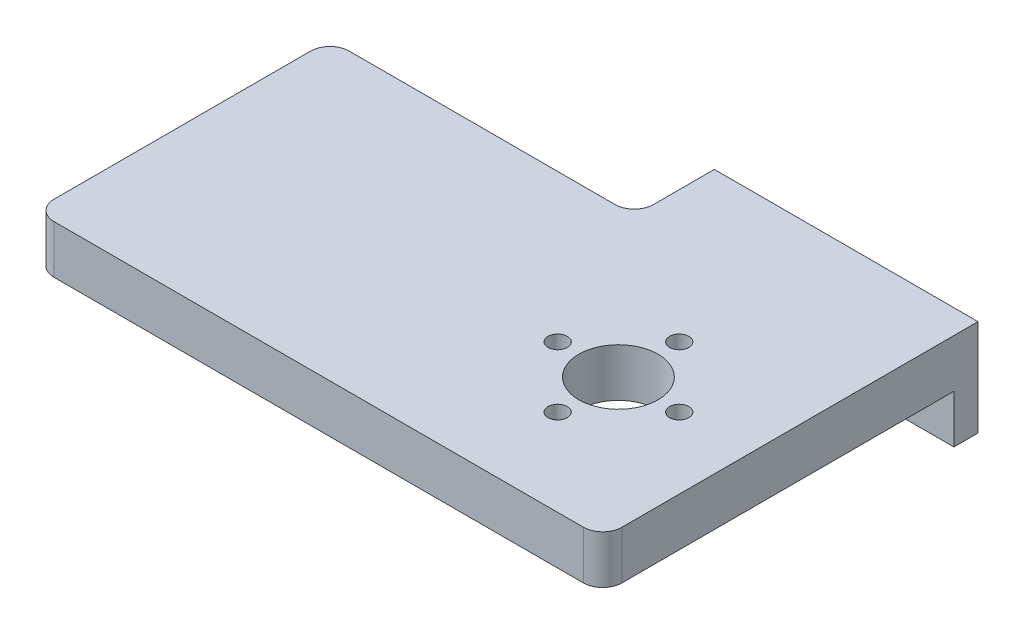
ISO-10303-21;
HEADER;
FILE_DESCRIPTION(('STEP AP214'),'2;1');
FILE_NAME('part.step','',(''),(''),'','','');
FILE_SCHEMA(('AUTOMOTIVE_DESIGN { 1 0 10303 214 1 1 1 1 }'));
ENDSEC;
DATA;
#1=APPLICATION_CONTEXT('core data for automotive mechanical design processes');
#2=APPLICATION_PROTOCOL_DEFINITION('international standard','automotive_design',2000,#1);
#3=PRODUCT_CONTEXT('',#1,'mechanical');
#4=PRODUCT('Part','Part','',(#3));
#5=PRODUCT_RELATED_PRODUCT_CATEGORY('part','',(#4));
#6=PRODUCT_DEFINITION_FORMATION('','',#4);
#7=PRODUCT_DEFINITION_CONTEXT('part definition',#1,'design');
#8=PRODUCT_DEFINITION('design','',#6,#7);
#9=PRODUCT_DEFINITION_SHAPE('','',#8);
#10=(LENGTH_UNIT() NAMED_UNIT(*) SI_UNIT(.MILLI.,.METRE.));
#11=(NAMED_UNIT(*) PLANE_ANGLE_UNIT() SI_UNIT($,.RADIAN.));
#12=(NAMED_UNIT(*) SI_UNIT($,.STERADIAN.) SOLID_ANGLE_UNIT());
#13=UNCERTAINTY_MEASURE_WITH_UNIT(LENGTH_MEASURE(1.E-05),#10,'distance_accuracy_value','');
#14=(GEOMETRIC_REPRESENTATION_CONTEXT(3) GLOBAL_UNCERTAINTY_ASSIGNED_CONTEXT((#13)) GLOBAL_UNIT_ASSIGNED_CONTEXT((#10,
#11,#12)) REPRESENTATION_CONTEXT('',''));
#15=CARTESIAN_POINT('',(0.,0.,0.));
#16=DIRECTION('',(0.,0.,1.));
#17=DIRECTION('',(1.,0.,0.));
#18=AXIS2_PLACEMENT_3D('',#15,#16,#17);
#19=CARTESIAN_POINT('',(-19.6575695119962,6.35,28.2169488414724));
#20=DIRECTION('',(0.,-1.,0.));
#21=DIRECTION('',(0.,0.,-1.));
#22=AXIS2_PLACEMENT_3D('',#19,#20,#21);
#23=CYLINDRICAL_SURFACE('',#22,16.256);
#24=CARTESIAN_POINT('',(-19.6575695119962,0.,28.2169488414724));
#25=DIRECTION('',(0.,1.,0.));
#26=DIRECTION('',(0.,0.,1.));
#27=AXIS2_PLACEMENT_3D('',#24,#25,#26);
#28=CIRCLE('',#27,16.256);
#29=CARTESIAN_POINT('',(-19.6575695119962,0.,44.4729488414724));
#30=VERTEX_POINT('',#29);
#31=EDGE_CURVE('E190',#30,#30,#28,.T.);
#32=ORIENTED_EDGE('',*,*,#31,.F.);
#33=EDGE_LOOP('',(#32));
#34=FACE_BOUND('',#33,.T.);
#35=CARTESIAN_POINT('',(-19.6575695119962,3.175,28.2169488414724));
#36=DIRECTION('',(0.,1.,0.));
#37=DIRECTION('',(0.,0.,1.));
#38=AXIS2_PLACEMENT_3D('',#35,#36,#37);
#39=CIRCLE('',#38,16.256);
#40=CARTESIAN_POINT('',(-19.6575695119962,3.175,44.4729488414724));
#41=VERTEX_POINT('',#40);
#42=EDGE_CURVE('E163',#41,#41,#39,.T.);
#43=ORIENTED_EDGE('',*,*,#42,.T.);
#44=EDGE_LOOP('',(#43));
#45=FACE_BOUND('',#44,.T.);
#46=ADVANCED_FACE('F35',(#34,#45),#23,.F.);
#47=CARTESIAN_POINT('',(32.4904304880038,6.35,0.));
#48=DIRECTION('',(1.,0.,0.));
#49=DIRECTION('',(0.,0.,-1.));
#50=AXIS2_PLACEMENT_3D('',#47,#48,#49);
#51=PLANE('',#50);
#52=DIRECTION('',(0.,0.,1.));
#53=VECTOR('',#52,1.);
#54=CARTESIAN_POINT('',(32.4904304880038,6.35,0.));
#55=LINE('',#54,#53);
#56=CARTESIAN_POINT('',(32.4904304880038,6.35,-1.75505115852755));
#57=VERTEX_POINT('',#56);
#58=CARTESIAN_POINT('',(32.4904304880038,6.35,45.1079488414724));
#59=VERTEX_POINT('',#58);
#60=EDGE_CURVE('E171',#57,#59,#55,.T.);
#61=ORIENTED_EDGE('',*,*,#60,.T.);
#62=DIRECTION('',(0.,-1.,0.));
#63=VECTOR('',#62,1.);
#64=CARTESIAN_POINT('',(32.4904304880038,0.,45.1079488414724));
#65=LINE('',#64,#63);
#66=CARTESIAN_POINT('',(32.4904304880038,0.,45.1079488414724));
#67=VERTEX_POINT('',#66);
#68=EDGE_CURVE('E236',#59,#67,#65,.T.);
#69=ORIENTED_EDGE('',*,*,#68,.T.);
#70=DIRECTION('',(0.,0.,1.));
#71=VECTOR('',#70,1.);
#72=CARTESIAN_POINT('',(32.4904304880038,0.,0.));
#73=LINE('',#72,#71);
#74=CARTESIAN_POINT('',(32.4904304880038,0.,1.41994884147245));
#75=VERTEX_POINT('',#74);
#76=EDGE_CURVE('E193',#75,#67,#73,.T.);
#77=ORIENTED_EDGE('',*,*,#76,.F.);
#78=DIRECTION('',(0.,1.,0.));
#79=VECTOR('',#78,1.);
#80=CARTESIAN_POINT('',(32.4904304880038,-6.35,1.41994884147245));
#81=LINE('',#80,#79);
#82=CARTESIAN_POINT('',(32.4904304880038,-6.35,1.41994884147245));
#83=VERTEX_POINT('',#82);
#84=EDGE_CURVE('E138',#83,#75,#81,.T.);
#85=ORIENTED_EDGE('',*,*,#84,.F.);
#86=DIRECTION('',(0.,0.,-1.));
#87=VECTOR('',#86,1.);
#88=CARTESIAN_POINT('',(32.4904304880038,-6.35,-1.75505115852755));
#89=LINE('',#88,#87);
#90=CARTESIAN_POINT('',(32.4904304880038,-6.35,-1.75505115852755));
#91=VERTEX_POINT('',#90);
#92=EDGE_CURVE('E149',#83,#91,#89,.T.);
#93=ORIENTED_EDGE('',*,*,#92,.T.);
#94=DIRECTION('',(0.,-1.,0.));
#95=VECTOR('',#94,1.);
#96=CARTESIAN_POINT('',(32.4904304880038,6.35,-1.75505115852755));
#97=LINE('',#96,#95);
#98=EDGE_CURVE('E206',#57,#91,#97,.T.);
#99=ORIENTED_EDGE('',*,*,#98,.F.);
#100=EDGE_LOOP('',(#61,#69,#77,#85,#93,#99));
#101=FACE_BOUND('',#100,.T.);
#102=ADVANCED_FACE('F269',(#101),#51,.T.);
#103=CARTESIAN_POINT('',(0.,6.35,-1.75505115852755));
#104=DIRECTION('',(0.,0.,1.));
#105=DIRECTION('',(1.,0.,0.));
#106=AXIS2_PLACEMENT_3D('',#103,#104,#105);
#107=PLANE('',#106);
#108=ORIENTED_EDGE('',*,*,#98,.T.);
#109=DIRECTION('',(-1.,0.,0.));
#110=VECTOR('',#109,1.);
#111=CARTESIAN_POINT('',(-2.20956951199619,-6.35,-1.75505115852755));
#112=LINE('',#111,#110);
#113=CARTESIAN_POINT('',(-2.20956951199619,-6.35,-1.75505115852755));
#114=VERTEX_POINT('',#113);
#115=EDGE_CURVE('E139',#91,#114,#112,.T.);
#116=ORIENTED_EDGE('',*,*,#115,.T.);
#117=DIRECTION('',(0.,-1.,0.));
#118=VECTOR('',#117,1.);
#119=CARTESIAN_POINT('',(-2.20956951199619,6.35,-1.75505115852755));
#120=LINE('',#119,#118);
#121=CARTESIAN_POINT('',(-2.20956951199619,6.35,-1.75505115852755));
#122=VERTEX_POINT('',#121);
#123=EDGE_CURVE('E153',#122,#114,#120,.T.);
#124=ORIENTED_EDGE('',*,*,#123,.F.);
#125=DIRECTION('',(-1.,0.,0.));
#126=VECTOR('',#125,1.);
#127=CARTESIAN_POINT('',(0.,6.35,-1.75505115852755));
#128=LINE('',#127,#126);
#129=EDGE_CURVE('E174',#57,#122,#128,.T.);
#130=ORIENTED_EDGE('',*,*,#129,.F.);
#131=EDGE_LOOP('',(#108,#116,#124,#130));
#132=FACE_BOUND('',#131,.T.);
#133=ADVANCED_FACE('F275',(#132),#107,.F.);
#134=CARTESIAN_POINT('',(-2.20956951199619,6.35,0.));
#135=DIRECTION('',(1.,0.,0.));
#136=DIRECTION('',(0.,0.,-1.));
#137=AXIS2_PLACEMENT_3D('',#134,#135,#136);
#138=PLANE('',#137);
#139=DIRECTION('',(0.,0.,1.));
#140=VECTOR('',#139,1.);
#141=CARTESIAN_POINT('',(-2.20956951199619,0.,0.));
#142=LINE('',#141,#140);
#143=CARTESIAN_POINT('',(-2.20956951199619,0.,1.41994884147245));
#144=VERTEX_POINT('',#143);
#145=CARTESIAN_POINT('',(-2.20956951199619,0.,6.24594884147244));
#146=VERTEX_POINT('',#145);
#147=EDGE_CURVE('E196',#144,#146,#142,.T.);
#148=ORIENTED_EDGE('',*,*,#147,.T.);
#149=DIRECTION('',(0.,-1.,0.));
#150=VECTOR('',#149,1.);
#151=CARTESIAN_POINT('',(-2.20956951199619,6.35,6.24594884147244));
#152=LINE('',#151,#150);
#153=CARTESIAN_POINT('',(-2.20956951199619,6.35,6.24594884147244));
#154=VERTEX_POINT('',#153);
#155=EDGE_CURVE('E214',#146,#154,#152,.F.);
#156=ORIENTED_EDGE('',*,*,#155,.T.);
#157=DIRECTION('',(0.,0.,1.));
#158=VECTOR('',#157,1.);
#159=CARTESIAN_POINT('',(-2.20956951199619,6.35,0.));
#160=LINE('',#159,#158);
#161=EDGE_CURVE('E177',#122,#154,#160,.T.);
#162=ORIENTED_EDGE('',*,*,#161,.F.);
#163=ORIENTED_EDGE('',*,*,#123,.T.);
#164=DIRECTION('',(0.,0.,1.));
#165=VECTOR('',#164,1.);
#166=CARTESIAN_POINT('',(-2.20956951199619,-6.35,-1.75505115852755));
#167=LINE('',#166,#165);
#168=CARTESIAN_POINT('',(-2.20956951199619,-6.35,1.41994884147245));
#169=VERTEX_POINT('',#168);
#170=EDGE_CURVE('E146',#114,#169,#167,.T.);
#171=ORIENTED_EDGE('',*,*,#170,.T.);
#172=DIRECTION('',(0.,1.,0.));
#173=VECTOR('',#172,1.);
#174=CARTESIAN_POINT('',(-2.20956951199619,-6.35,1.41994884147245));
#175=LINE('',#174,#173);
#176=EDGE_CURVE('E128',#169,#144,#175,.T.);
#177=ORIENTED_EDGE('',*,*,#176,.T.);
#178=EDGE_LOOP('',(#148,#156,#162,#163,#171,#177));
#179=FACE_BOUND('',#178,.T.);
#180=ADVANCED_FACE('F151',(#179),#138,.F.);
#181=CARTESIAN_POINT('',(0.,6.35,8.78594884147244));
#182=DIRECTION('',(0.,0.,-1.));
#183=DIRECTION('',(-1.,0.,0.));
#184=AXIS2_PLACEMENT_3D('',#181,#182,#183);
#185=PLANE('',#184);
#186=DIRECTION('',(1.,0.,0.));
#187=VECTOR('',#186,1.);
#188=CARTESIAN_POINT('',(0.,6.35,8.78594884147244));
#189=LINE('',#188,#187);
#190=CARTESIAN_POINT('',(-39.7235695119962,6.35,8.78594884147244));
#191=VERTEX_POINT('',#190);
#192=CARTESIAN_POINT('',(-4.74956951199619,6.35,8.78594884147244));
#193=VERTEX_POINT('',#192);
#194=EDGE_CURVE('E180',#191,#193,#189,.T.);
#195=ORIENTED_EDGE('',*,*,#194,.T.);
#196=DIRECTION('',(0.,-1.,0.));
#197=VECTOR('',#196,1.);
#198=CARTESIAN_POINT('',(-4.74956951199619,6.35,8.78594884147244));
#199=LINE('',#198,#197);
#200=CARTESIAN_POINT('',(-4.74956951199619,0.,8.78594884147244));
#201=VERTEX_POINT('',#200);
#202=EDGE_CURVE('E211',#193,#201,#199,.T.);
#203=ORIENTED_EDGE('',*,*,#202,.T.);
#204=DIRECTION('',(1.,0.,0.));
#205=VECTOR('',#204,1.);
#206=CARTESIAN_POINT('',(0.,0.,8.78594884147244));
#207=LINE('',#206,#205);
#208=CARTESIAN_POINT('',(-39.7235695119962,0.,8.78594884147244));
#209=VERTEX_POINT('',#208);
#210=EDGE_CURVE('E198',#209,#201,#207,.T.);
#211=ORIENTED_EDGE('',*,*,#210,.F.);
#212=DIRECTION('',(0.,-1.,0.));
#213=VECTOR('',#212,1.);
#214=CARTESIAN_POINT('',(-39.7235695119962,6.35,8.78594884147244));
#215=LINE('',#214,#213);
#216=EDGE_CURVE('E209',#209,#191,#215,.F.);
#217=ORIENTED_EDGE('',*,*,#216,.T.);
#218=EDGE_LOOP('',(#195,#203,#211,#217));
#219=FACE_BOUND('',#218,.T.);
#220=ADVANCED_FACE('F321',(#219),#185,.T.);
#221=CARTESIAN_POINT('',(-42.2635695119962,6.35,0.));
#222=DIRECTION('',(1.,0.,0.));
#223=DIRECTION('',(0.,0.,-1.));
#224=AXIS2_PLACEMENT_3D('',#221,#222,#223);
#225=PLANE('',#224);
#226=DIRECTION('',(0.,0.,1.));
#227=VECTOR('',#226,1.);
#228=CARTESIAN_POINT('',(-42.2635695119962,6.35,0.));
#229=LINE('',#228,#227);
#230=CARTESIAN_POINT('',(-42.2635695119962,6.35,11.3259488414724));
#231=VERTEX_POINT('',#230);
#232=CARTESIAN_POINT('',(-42.2635695119962,6.35,45.1079488414724));
#233=VERTEX_POINT('',#232);
#234=EDGE_CURVE('E183',#231,#233,#229,.T.);
#235=ORIENTED_EDGE('',*,*,#234,.F.);
#236=DIRECTION('',(0.,-1.,0.));
#237=VECTOR('',#236,1.);
#238=CARTESIAN_POINT('',(-42.2635695119962,0.,11.3259488414724));
#239=LINE('',#238,#237);
#240=CARTESIAN_POINT('',(-42.2635695119962,0.,11.3259488414724));
#241=VERTEX_POINT('',#240);
#242=EDGE_CURVE('E218',#231,#241,#239,.T.);
#243=ORIENTED_EDGE('',*,*,#242,.T.);
#244=DIRECTION('',(0.,0.,1.));
#245=VECTOR('',#244,1.);
#246=CARTESIAN_POINT('',(-42.2635695119962,0.,0.));
#247=LINE('',#246,#245);
#248=CARTESIAN_POINT('',(-42.2635695119962,0.,45.1079488414724));
#249=VERTEX_POINT('',#248);
#250=EDGE_CURVE('E201',#241,#249,#247,.T.);
#251=ORIENTED_EDGE('',*,*,#250,.T.);
#252=DIRECTION('',(0.,-1.,0.));
#253=VECTOR('',#252,1.);
#254=CARTESIAN_POINT('',(-42.2635695119962,6.35,45.1079488414724));
#255=LINE('',#254,#253);
#256=EDGE_CURVE('E216',#249,#233,#255,.F.);
#257=ORIENTED_EDGE('',*,*,#256,.T.);
#258=EDGE_LOOP('',(#235,#243,#251,#257));
#259=FACE_BOUND('',#258,.T.);
#260=ADVANCED_FACE('F286',(#259),#225,.F.);
#261=CARTESIAN_POINT('',(15.1404304880038,6.35,28.2169488414724));
#262=DIRECTION('',(0.,-1.,0.));
#263=DIRECTION('',(0.,0.,-1.));
#264=AXIS2_PLACEMENT_3D('',#261,#262,#263);
#265=CYLINDRICAL_SURFACE('',#264,5.207);
#266=CARTESIAN_POINT('',(15.1404304880038,6.35,28.2169488414724));
#267=DIRECTION('',(0.,1.,0.));
#268=DIRECTION('',(0.,0.,1.));
#269=AXIS2_PLACEMENT_3D('',#266,#267,#268);
#270=CIRCLE('',#269,5.207);
#271=CARTESIAN_POINT('',(15.1404304880038,6.35,33.4239488414724));
#272=VERTEX_POINT('',#271);
#273=EDGE_CURVE('E168',#272,#272,#270,.T.);
#274=ORIENTED_EDGE('',*,*,#273,.T.);
#275=EDGE_LOOP('',(#274));
#276=FACE_BOUND('',#275,.T.);
#277=CARTESIAN_POINT('',(15.1404304880038,0.,28.2169488414724));
#278=DIRECTION('',(0.,1.,0.));
#279=DIRECTION('',(0.,0.,1.));
#280=AXIS2_PLACEMENT_3D('',#277,#278,#279);
#281=CIRCLE('',#280,5.207);
#282=CARTESIAN_POINT('',(15.1404304880038,0.,33.4239488414724));
#283=VERTEX_POINT('',#282);
#284=EDGE_CURVE('E167',#283,#283,#281,.T.);
#285=ORIENTED_EDGE('',*,*,#284,.F.);
#286=EDGE_LOOP('',(#285));
#287=FACE_BOUND('',#286,.T.);
#288=ADVANCED_FACE('F282',(#276,#287),#265,.F.);
#289=CARTESIAN_POINT('',(0.,6.35,47.6479488414724));
#290=DIRECTION('',(0.,0.,-1.));
#291=DIRECTION('',(-1.,0.,0.));
#292=AXIS2_PLACEMENT_3D('',#289,#290,#291);
#293=PLANE('',#292);
#294=DIRECTION('',(1.,0.,0.));
#295=VECTOR('',#294,1.);
#296=CARTESIAN_POINT('',(0.,6.35,47.6479488414724));
#297=LINE('',#296,#295);
#298=CARTESIAN_POINT('',(-39.7235695119962,6.35,47.6479488414724));
#299=VERTEX_POINT('',#298);
#300=CARTESIAN_POINT('',(29.9504304880038,6.35,47.6479488414724));
#301=VERTEX_POINT('',#300);
#302=EDGE_CURVE('E186',#299,#301,#297,.T.);
#303=ORIENTED_EDGE('',*,*,#302,.F.);
#304=DIRECTION('',(0.,-1.,0.));
#305=VECTOR('',#304,1.);
#306=CARTESIAN_POINT('',(-39.7235695119962,6.35,47.6479488414724));
#307=LINE('',#306,#305);
#308=CARTESIAN_POINT('',(-39.7235695119962,0.,47.6479488414724));
#309=VERTEX_POINT('',#308);
#310=EDGE_CURVE('E233',#299,#309,#307,.T.);
#311=ORIENTED_EDGE('',*,*,#310,.T.);
#312=DIRECTION('',(1.,0.,0.));
#313=VECTOR('',#312,1.);
#314=CARTESIAN_POINT('',(0.,0.,47.6479488414724));
#315=LINE('',#314,#313);
#316=CARTESIAN_POINT('',(29.9504304880038,0.,47.6479488414724));
#317=VERTEX_POINT('',#316);
#318=EDGE_CURVE('E172',#309,#317,#315,.T.);
#319=ORIENTED_EDGE('',*,*,#318,.T.);
#320=DIRECTION('',(0.,-1.,0.));
#321=VECTOR('',#320,1.);
#322=CARTESIAN_POINT('',(29.9504304880038,6.35,47.6479488414724));
#323=LINE('',#322,#321);
#324=EDGE_CURVE('E60',#317,#301,#323,.F.);
#325=ORIENTED_EDGE('',*,*,#324,.T.);
#326=EDGE_LOOP('',(#303,#311,#319,#325));
#327=FACE_BOUND('',#326,.T.);
#328=ADVANCED_FACE('F285',(#327),#293,.F.);
#329=CARTESIAN_POINT('',(0.,6.35,0.));
#330=DIRECTION('',(0.,1.,0.));
#331=DIRECTION('',(0.,0.,1.));
#332=AXIS2_PLACEMENT_3D('',#329,#330,#331);
#333=PLANE('',#332);
#334=CARTESIAN_POINT('',(15.1404304880038,6.35,20.2159488414724));
#335=DIRECTION('',(0.,1.,0.));
#336=DIRECTION('',(0.,0.,1.));
#337=AXIS2_PLACEMENT_3D('',#334,#335,#336);
#338=CIRCLE('',#337,1.27);
#339=CARTESIAN_POINT('',(15.1404304880038,6.35,21.4859488414724));
#340=VERTEX_POINT('',#339);
#341=EDGE_CURVE('E244',#340,#340,#338,.T.);
#342=ORIENTED_EDGE('',*,*,#341,.F.);
#343=EDGE_LOOP('',(#342));
#344=FACE_BOUND('',#343,.T.);
#345=CARTESIAN_POINT('',(23.1414304880038,6.35,28.2169488414724));
#346=DIRECTION('',(0.,1.,0.));
#347=DIRECTION('',(0.,0.,1.));
#348=AXIS2_PLACEMENT_3D('',#345,#346,#347);
#349=CIRCLE('',#348,1.27);
#350=CARTESIAN_POINT('',(23.1414304880038,6.35,29.4869488414724));
#351=VERTEX_POINT('',#350);
#352=EDGE_CURVE('E500',#351,#351,#349,.T.);
#353=ORIENTED_EDGE('',*,*,#352,.F.);
#354=EDGE_LOOP('',(#353));
#355=FACE_BOUND('',#354,.T.);
#356=CARTESIAN_POINT('',(15.1404304880038,6.35,36.2179488414724));
#357=DIRECTION('',(0.,1.,0.));
#358=DIRECTION('',(0.,0.,1.));
#359=AXIS2_PLACEMENT_3D('',#356,#357,#358);
#360=CIRCLE('',#359,1.27);
#361=CARTESIAN_POINT('',(15.1404304880038,6.35,37.4879488414724));
#362=VERTEX_POINT('',#361);
#363=EDGE_CURVE('E498',#362,#362,#360,.T.);
#364=ORIENTED_EDGE('',*,*,#363,.F.);
#365=EDGE_LOOP('',(#364));
#366=FACE_BOUND('',#365,.T.);
#367=CARTESIAN_POINT('',(7.13943048800381,6.35,28.2169488414724));
#368=DIRECTION('',(0.,1.,0.));
#369=DIRECTION('',(0.,0.,1.));
#370=AXIS2_PLACEMENT_3D('',#367,#368,#369);
#371=CIRCLE('',#370,1.27);
#372=CARTESIAN_POINT('',(7.13943048800381,6.35,29.4869488414724));
#373=VERTEX_POINT('',#372);
#374=EDGE_CURVE('E158',#373,#373,#371,.T.);
#375=ORIENTED_EDGE('',*,*,#374,.F.);
#376=EDGE_LOOP('',(#375));
#377=FACE_BOUND('',#376,.T.);
#378=ORIENTED_EDGE('',*,*,#194,.F.);
#379=CARTESIAN_POINT('',(-39.7235695119962,6.35,11.3259488414724));
#380=DIRECTION('',(0.,1.,0.));
#381=DIRECTION('',(0.,0.,1.));
#382=AXIS2_PLACEMENT_3D('',#379,#380,#381);
#383=CIRCLE('',#382,2.54);
#384=EDGE_CURVE('E230',#191,#231,#383,.T.);
#385=ORIENTED_EDGE('',*,*,#384,.T.);
#386=ORIENTED_EDGE('',*,*,#234,.T.);
#387=CARTESIAN_POINT('',(-39.7235695119962,6.35,45.1079488414724));
#388=DIRECTION('',(0.,1.,0.));
#389=DIRECTION('',(0.,0.,1.));
#390=AXIS2_PLACEMENT_3D('',#387,#388,#389);
#391=CIRCLE('',#390,2.54);
#392=EDGE_CURVE('E228',#233,#299,#391,.T.);
#393=ORIENTED_EDGE('',*,*,#392,.T.);
#394=ORIENTED_EDGE('',*,*,#302,.T.);
#395=CARTESIAN_POINT('',(29.9504304880038,6.35,45.1079488414724));
#396=DIRECTION('',(0.,1.,0.));
#397=DIRECTION('',(0.,0.,1.));
#398=AXIS2_PLACEMENT_3D('',#395,#396,#397);
#399=CIRCLE('',#398,2.54);
#400=EDGE_CURVE('E52',#301,#59,#399,.T.);
#401=ORIENTED_EDGE('',*,*,#400,.T.);
#402=ORIENTED_EDGE('',*,*,#60,.F.);
#403=ORIENTED_EDGE('',*,*,#129,.T.);
#404=ORIENTED_EDGE('',*,*,#161,.T.);
#405=CARTESIAN_POINT('',(-4.74956951199619,6.35,6.24594884147244));
#406=DIRECTION('',(0.,1.,0.));
#407=DIRECTION('',(0.,0.,1.));
#408=AXIS2_PLACEMENT_3D('',#405,#406,#407);
#409=CIRCLE('',#408,2.54);
#410=EDGE_CURVE('E11',#154,#193,#409,.F.);
#411=ORIENTED_EDGE('',*,*,#410,.T.);
#412=EDGE_LOOP('',(#378,#385,#386,#393,#394,#401,#402,#403,#404,#411));
#413=FACE_BOUND('',#412,.T.);
#414=ORIENTED_EDGE('',*,*,#273,.F.);
#415=EDGE_LOOP('',(#414));
#416=FACE_BOUND('',#415,.T.);
#417=ADVANCED_FACE('F306',(#344,#355,#366,#377,#413,#416),#333,.T.);
#418=CARTESIAN_POINT('',(0.,0.,0.));
#419=DIRECTION('',(0.,1.,0.));
#420=DIRECTION('',(0.,0.,1.));
#421=AXIS2_PLACEMENT_3D('',#418,#419,#420);
#422=PLANE('',#421);
#423=CARTESIAN_POINT('',(15.1404304880038,0.,20.2159488414724));
#424=DIRECTION('',(0.,1.,0.));
#425=DIRECTION('',(0.,0.,1.));
#426=AXIS2_PLACEMENT_3D('',#423,#424,#425);
#427=CIRCLE('',#426,1.27);
#428=CARTESIAN_POINT('',(15.1404304880038,0.,21.4859488414724));
#429=VERTEX_POINT('',#428);
#430=EDGE_CURVE('E39',#429,#429,#427,.T.);
#431=ORIENTED_EDGE('',*,*,#430,.T.);
#432=EDGE_LOOP('',(#431));
#433=FACE_BOUND('',#432,.T.);
#434=CARTESIAN_POINT('',(23.1414304880038,0.,28.2169488414724));
#435=DIRECTION('',(0.,1.,0.));
#436=DIRECTION('',(0.,0.,1.));
#437=AXIS2_PLACEMENT_3D('',#434,#435,#436);
#438=CIRCLE('',#437,1.27);
#439=CARTESIAN_POINT('',(23.1414304880038,0.,29.4869488414724));
#440=VERTEX_POINT('',#439);
#441=EDGE_CURVE('E156',#440,#440,#438,.T.);
#442=ORIENTED_EDGE('',*,*,#441,.T.);
#443=EDGE_LOOP('',(#442));
#444=FACE_BOUND('',#443,.T.);
#445=CARTESIAN_POINT('',(15.1404304880038,0.,36.2179488414724));
#446=DIRECTION('',(0.,1.,0.));
#447=DIRECTION('',(0.,0.,1.));
#448=AXIS2_PLACEMENT_3D('',#445,#446,#447);
#449=CIRCLE('',#448,1.27);
#450=CARTESIAN_POINT('',(15.1404304880038,0.,37.4879488414724));
#451=VERTEX_POINT('',#450);
#452=EDGE_CURVE('E243',#451,#451,#449,.T.);
#453=ORIENTED_EDGE('',*,*,#452,.T.);
#454=EDGE_LOOP('',(#453));
#455=FACE_BOUND('',#454,.T.);
#456=CARTESIAN_POINT('',(7.13943048800381,0.,28.2169488414724));
#457=DIRECTION('',(0.,1.,0.));
#458=DIRECTION('',(0.,0.,1.));
#459=AXIS2_PLACEMENT_3D('',#456,#457,#458);
#460=CIRCLE('',#459,1.27);
#461=CARTESIAN_POINT('',(7.13943048800381,0.,29.4869488414724));
#462=VERTEX_POINT('',#461);
#463=EDGE_CURVE('E240',#462,#462,#460,.T.);
#464=ORIENTED_EDGE('',*,*,#463,.T.);
#465=EDGE_LOOP('',(#464));
#466=FACE_BOUND('',#465,.T.);
#467=ORIENTED_EDGE('',*,*,#284,.T.);
#468=EDGE_LOOP('',(#467));
#469=FACE_BOUND('',#468,.T.);
#470=ORIENTED_EDGE('',*,*,#31,.T.);
#471=EDGE_LOOP('',(#470));
#472=FACE_BOUND('',#471,.T.);
#473=ORIENTED_EDGE('',*,*,#250,.F.);
#474=CARTESIAN_POINT('',(-39.7235695119962,0.,11.3259488414724));
#475=DIRECTION('',(0.,1.,0.));
#476=DIRECTION('',(0.,0.,1.));
#477=AXIS2_PLACEMENT_3D('',#474,#475,#476);
#478=CIRCLE('',#477,2.54);
#479=EDGE_CURVE('E225',#241,#209,#478,.F.);
#480=ORIENTED_EDGE('',*,*,#479,.T.);
#481=ORIENTED_EDGE('',*,*,#210,.T.);
#482=CARTESIAN_POINT('',(-4.74956951199619,0.,6.24594884147244));
#483=DIRECTION('',(0.,1.,0.));
#484=DIRECTION('',(0.,0.,1.));
#485=AXIS2_PLACEMENT_3D('',#482,#483,#484);
#486=CIRCLE('',#485,2.54);
#487=EDGE_CURVE('E44',#201,#146,#486,.T.);
#488=ORIENTED_EDGE('',*,*,#487,.T.);
#489=ORIENTED_EDGE('',*,*,#147,.F.);
#490=DIRECTION('',(1.,0.,0.));
#491=VECTOR('',#490,1.);
#492=CARTESIAN_POINT('',(0.,0.,1.41994884147245));
#493=LINE('',#492,#491);
#494=EDGE_CURVE('E133',#144,#75,#493,.T.);
#495=ORIENTED_EDGE('',*,*,#494,.T.);
#496=ORIENTED_EDGE('',*,*,#76,.T.);
#497=CARTESIAN_POINT('',(29.9504304880038,0.,45.1079488414724));
#498=DIRECTION('',(0.,1.,0.));
#499=DIRECTION('',(0.,0.,1.));
#500=AXIS2_PLACEMENT_3D('',#497,#498,#499);
#501=CIRCLE('',#500,2.54);
#502=EDGE_CURVE('E221',#67,#317,#501,.F.);
#503=ORIENTED_EDGE('',*,*,#502,.T.);
#504=ORIENTED_EDGE('',*,*,#318,.F.);
#505=CARTESIAN_POINT('',(-39.7235695119962,0.,45.1079488414724));
#506=DIRECTION('',(0.,1.,0.));
#507=DIRECTION('',(0.,0.,1.));
#508=AXIS2_PLACEMENT_3D('',#505,#506,#507);
#509=CIRCLE('',#508,2.54);
#510=EDGE_CURVE('E223',#309,#249,#509,.F.);
#511=ORIENTED_EDGE('',*,*,#510,.T.);
#512=EDGE_LOOP('',(#473,#480,#481,#488,#489,#495,#496,#503,#504,#511));
#513=FACE_BOUND('',#512,.T.);
#514=ADVANCED_FACE('F249',(#433,#444,#455,#466,#469,#472,#513),#422,.F.);
#515=CARTESIAN_POINT('',(-19.6575695119962,3.175,28.2169488414724));
#516=DIRECTION('',(0.,1.,0.));
#517=DIRECTION('',(0.,0.,1.));
#518=AXIS2_PLACEMENT_3D('',#515,#516,#517);
#519=PLANE('',#518);
#520=ORIENTED_EDGE('',*,*,#42,.F.);
#521=EDGE_LOOP('',(#520));
#522=FACE_BOUND('',#521,.T.);
#523=ADVANCED_FACE('F412',(#522),#519,.F.);
#524=CARTESIAN_POINT('',(-2.20956951199619,-6.35,1.41994884147245));
#525=DIRECTION('',(0.,0.,1.));
#526=DIRECTION('',(1.,0.,0.));
#527=AXIS2_PLACEMENT_3D('',#524,#525,#526);
#528=PLANE('',#527);
#529=ORIENTED_EDGE('',*,*,#494,.F.);
#530=ORIENTED_EDGE('',*,*,#176,.F.);
#531=DIRECTION('',(1.,0.,0.));
#532=VECTOR('',#531,1.);
#533=CARTESIAN_POINT('',(-2.20956951199619,-6.35,1.41994884147245));
#534=LINE('',#533,#532);
#535=EDGE_CURVE('E131',#169,#83,#534,.T.);
#536=ORIENTED_EDGE('',*,*,#535,.T.);
#537=ORIENTED_EDGE('',*,*,#84,.T.);
#538=EDGE_LOOP('',(#529,#530,#536,#537));
#539=FACE_BOUND('',#538,.T.);
#540=ADVANCED_FACE('F130',(#539),#528,.T.);
#541=CARTESIAN_POINT('',(0.,-6.35,0.));
#542=DIRECTION('',(0.,1.,0.));
#543=DIRECTION('',(0.,0.,1.));
#544=AXIS2_PLACEMENT_3D('',#541,#542,#543);
#545=PLANE('',#544);
#546=ORIENTED_EDGE('',*,*,#170,.F.);
#547=ORIENTED_EDGE('',*,*,#115,.F.);
#548=ORIENTED_EDGE('',*,*,#92,.F.);
#549=ORIENTED_EDGE('',*,*,#535,.F.);
#550=EDGE_LOOP('',(#546,#547,#548,#549));
#551=FACE_BOUND('',#550,.T.);
#552=ADVANCED_FACE('F144',(#551),#545,.F.);
#553=CARTESIAN_POINT('',(-4.74956951199619,6.35,6.24594884147244));
#554=DIRECTION('',(0.,-1.,0.));
#555=DIRECTION('',(0.,0.,-1.));
#556=AXIS2_PLACEMENT_3D('',#553,#554,#555);
#557=CYLINDRICAL_SURFACE('',#556,2.54);
#558=ORIENTED_EDGE('',*,*,#410,.F.);
#559=ORIENTED_EDGE('',*,*,#155,.F.);
#560=ORIENTED_EDGE('',*,*,#487,.F.);
#561=ORIENTED_EDGE('',*,*,#202,.F.);
#562=EDGE_LOOP('',(#558,#559,#560,#561));
#563=FACE_BOUND('',#562,.T.);
#564=ADVANCED_FACE('F288',(#563),#557,.F.);
#565=CARTESIAN_POINT('',(-39.7235695119962,6.35,11.3259488414724));
#566=DIRECTION('',(0.,1.,0.));
#567=DIRECTION('',(0.,0.,1.));
#568=AXIS2_PLACEMENT_3D('',#565,#566,#567);
#569=CYLINDRICAL_SURFACE('',#568,2.54);
#570=ORIENTED_EDGE('',*,*,#384,.F.);
#571=ORIENTED_EDGE('',*,*,#216,.F.);
#572=ORIENTED_EDGE('',*,*,#479,.F.);
#573=ORIENTED_EDGE('',*,*,#242,.F.);
#574=EDGE_LOOP('',(#570,#571,#572,#573));
#575=FACE_BOUND('',#574,.T.);
#576=ADVANCED_FACE('F291',(#575),#569,.T.);
#577=CARTESIAN_POINT('',(-39.7235695119962,6.35,45.1079488414724));
#578=DIRECTION('',(0.,-1.,0.));
#579=DIRECTION('',(0.,0.,-1.));
#580=AXIS2_PLACEMENT_3D('',#577,#578,#579);
#581=CYLINDRICAL_SURFACE('',#580,2.54);
#582=ORIENTED_EDGE('',*,*,#392,.F.);
#583=ORIENTED_EDGE('',*,*,#256,.F.);
#584=ORIENTED_EDGE('',*,*,#510,.F.);
#585=ORIENTED_EDGE('',*,*,#310,.F.);
#586=EDGE_LOOP('',(#582,#583,#584,#585));
#587=FACE_BOUND('',#586,.T.);
#588=ADVANCED_FACE('F294',(#587),#581,.T.);
#589=CARTESIAN_POINT('',(29.9504304880038,6.35,45.1079488414724));
#590=DIRECTION('',(0.,1.,0.));
#591=DIRECTION('',(0.,0.,1.));
#592=AXIS2_PLACEMENT_3D('',#589,#590,#591);
#593=CYLINDRICAL_SURFACE('',#592,2.54);
#594=ORIENTED_EDGE('',*,*,#400,.F.);
#595=ORIENTED_EDGE('',*,*,#324,.F.);
#596=ORIENTED_EDGE('',*,*,#502,.F.);
#597=ORIENTED_EDGE('',*,*,#68,.F.);
#598=EDGE_LOOP('',(#594,#595,#596,#597));
#599=FACE_BOUND('',#598,.T.);
#600=ADVANCED_FACE('F37',(#599),#593,.T.);
#601=CARTESIAN_POINT('',(7.13943048800381,-6.35,28.2169488414724));
#602=DIRECTION('',(0.,1.,0.));
#603=DIRECTION('',(0.,0.,1.));
#604=AXIS2_PLACEMENT_3D('',#601,#602,#603);
#605=CYLINDRICAL_SURFACE('',#604,1.27);
#606=ORIENTED_EDGE('',*,*,#374,.T.);
#607=EDGE_LOOP('',(#606));
#608=FACE_BOUND('',#607,.T.);
#609=ORIENTED_EDGE('',*,*,#463,.F.);
#610=EDGE_LOOP('',(#609));
#611=FACE_BOUND('',#610,.T.);
#612=ADVANCED_FACE('F264',(#608,#611),#605,.F.);
#613=CARTESIAN_POINT('',(15.1404304880038,-6.35,36.2179488414724));
#614=DIRECTION('',(0.,1.,0.));
#615=DIRECTION('',(0.,0.,1.));
#616=AXIS2_PLACEMENT_3D('',#613,#614,#615);
#617=CYLINDRICAL_SURFACE('',#616,1.27);
#618=ORIENTED_EDGE('',*,*,#363,.T.);
#619=EDGE_LOOP('',(#618));
#620=FACE_BOUND('',#619,.T.);
#621=ORIENTED_EDGE('',*,*,#452,.F.);
#622=EDGE_LOOP('',(#621));
#623=FACE_BOUND('',#622,.T.);
#624=ADVANCED_FACE('F255',(#620,#623),#617,.F.);
#625=CARTESIAN_POINT('',(23.1414304880038,-6.35,28.2169488414724));
#626=DIRECTION('',(0.,1.,0.));
#627=DIRECTION('',(0.,0.,1.));
#628=AXIS2_PLACEMENT_3D('',#625,#626,#627);
#629=CYLINDRICAL_SURFACE('',#628,1.27);
#630=ORIENTED_EDGE('',*,*,#352,.T.);
#631=EDGE_LOOP('',(#630));
#632=FACE_BOUND('',#631,.T.);
#633=ORIENTED_EDGE('',*,*,#441,.F.);
#634=EDGE_LOOP('',(#633));
#635=FACE_BOUND('',#634,.T.);
#636=ADVANCED_FACE('F252',(#632,#635),#629,.F.);
#637=CARTESIAN_POINT('',(15.1404304880038,-6.35,20.2159488414724));
#638=DIRECTION('',(0.,1.,0.));
#639=DIRECTION('',(0.,0.,1.));
#640=AXIS2_PLACEMENT_3D('',#637,#638,#639);
#641=CYLINDRICAL_SURFACE('',#640,1.27);
#642=ORIENTED_EDGE('',*,*,#341,.T.);
#643=EDGE_LOOP('',(#642));
#644=FACE_BOUND('',#643,.T.);
#645=ORIENTED_EDGE('',*,*,#430,.F.);
#646=EDGE_LOOP('',(#645));
#647=FACE_BOUND('',#646,.T.);
#648=ADVANCED_FACE('F254',(#644,#647),#641,.F.);
#649=CLOSED_SHELL('',(#46,#102,#133,#180,#220,#260,#288,#328,#417,#514,#523,#540,#552,#564,#576,
#588,#600,#612,#624,#636,#648));
#650=MANIFOLD_SOLID_BREP('B2',#649);
#651=ADVANCED_BREP_SHAPE_REPRESENTATION('',(#18,#650),#14);
#652=SHAPE_DEFINITION_REPRESENTATION(#9,#651);
ENDSEC;
END-ISO-10303-21;
